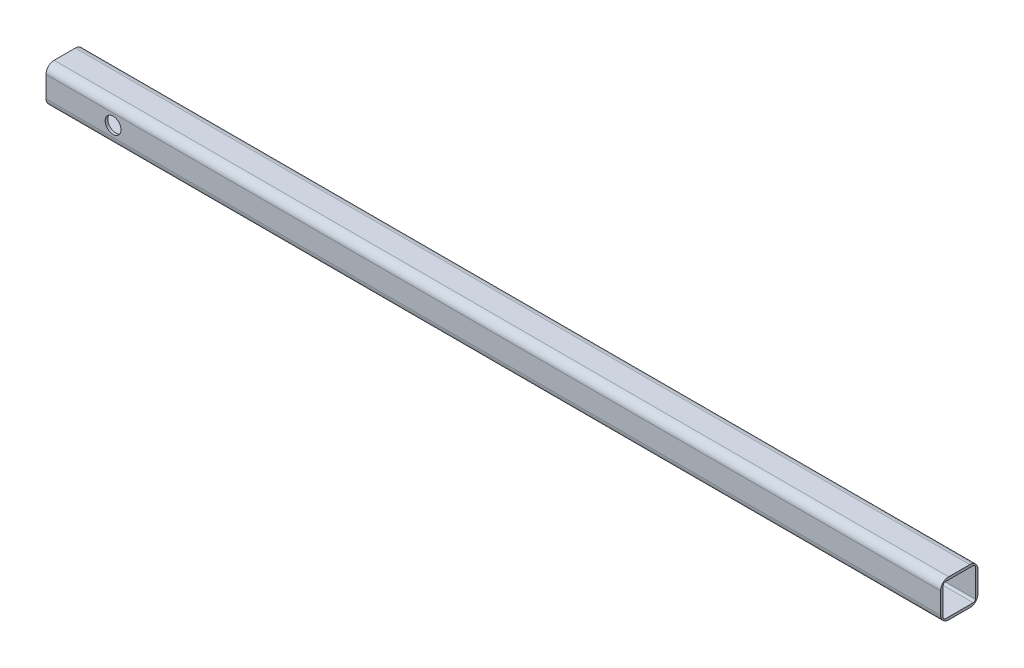
ISO-10303-21;
HEADER;
FILE_DESCRIPTION(('STEP AP214'),'2;1');
FILE_NAME('part.step','',(''),(''),'','','');
FILE_SCHEMA(('AUTOMOTIVE_DESIGN { 1 0 10303 214 1 1 1 1 }'));
ENDSEC;
DATA;
#1=APPLICATION_CONTEXT('core data for automotive mechanical design processes');
#2=APPLICATION_PROTOCOL_DEFINITION('international standard','automotive_design',2000,#1);
#3=PRODUCT_CONTEXT('',#1,'mechanical');
#4=PRODUCT('Part','Part','',(#3));
#5=PRODUCT_RELATED_PRODUCT_CATEGORY('part','',(#4));
#6=PRODUCT_DEFINITION_FORMATION('','',#4);
#7=PRODUCT_DEFINITION_CONTEXT('part definition',#1,'design');
#8=PRODUCT_DEFINITION('design','',#6,#7);
#9=PRODUCT_DEFINITION_SHAPE('','',#8);
#10=(LENGTH_UNIT() NAMED_UNIT(*) SI_UNIT(.MILLI.,.METRE.));
#11=(NAMED_UNIT(*) PLANE_ANGLE_UNIT() SI_UNIT($,.RADIAN.));
#12=(NAMED_UNIT(*) SI_UNIT($,.STERADIAN.) SOLID_ANGLE_UNIT());
#13=UNCERTAINTY_MEASURE_WITH_UNIT(LENGTH_MEASURE(1.E-05),#10,'distance_accuracy_value','');
#14=(GEOMETRIC_REPRESENTATION_CONTEXT(3) GLOBAL_UNCERTAINTY_ASSIGNED_CONTEXT((#13)) GLOBAL_UNIT_ASSIGNED_CONTEXT((#10,
#11,#12)) REPRESENTATION_CONTEXT('',''));
#15=CARTESIAN_POINT('',(0.,0.,0.));
#16=DIRECTION('',(0.,0.,1.));
#17=DIRECTION('',(1.,0.,0.));
#18=AXIS2_PLACEMENT_3D('',#15,#16,#17);
#19=CARTESIAN_POINT('',(558.8,18.288,-5.08));
#20=DIRECTION('',(1.,0.,0.));
#21=DIRECTION('',(0.,0.,-1.));
#22=AXIS2_PLACEMENT_3D('',#19,#20,#21);
#23=PLANE('',#22);
#24=CARTESIAN_POINT('',(558.8,18.288,-5.08));
#25=DIRECTION('',(1.,0.,0.));
#26=DIRECTION('',(0.,0.,-1.));
#27=AXIS2_PLACEMENT_3D('',#24,#25,#26);
#28=CIRCLE('',#27,5.08);
#29=CARTESIAN_POINT('',(558.8,23.368,-5.08));
#30=VERTEX_POINT('',#29);
#31=CARTESIAN_POINT('',(558.8,18.288,0.));
#32=VERTEX_POINT('',#31);
#33=EDGE_CURVE('E218',#30,#32,#28,.T.);
#34=ORIENTED_EDGE('',*,*,#33,.T.);
#35=DIRECTION('',(0.,-1.,0.));
#36=VECTOR('',#35,1.);
#37=CARTESIAN_POINT('',(558.8,5.08,0.));
#38=LINE('',#37,#36);
#39=CARTESIAN_POINT('',(558.8,5.08,0.));
#40=VERTEX_POINT('',#39);
#41=EDGE_CURVE('E221',#32,#40,#38,.T.);
#42=ORIENTED_EDGE('',*,*,#41,.T.);
#43=CARTESIAN_POINT('',(558.8,5.08,-5.08));
#44=DIRECTION('',(1.,0.,0.));
#45=DIRECTION('',(0.,0.,-1.));
#46=AXIS2_PLACEMENT_3D('',#43,#44,#45);
#47=CIRCLE('',#46,5.08);
#48=CARTESIAN_POINT('',(558.8,0.,-5.08));
#49=VERTEX_POINT('',#48);
#50=EDGE_CURVE('E224',#40,#49,#47,.T.);
#51=ORIENTED_EDGE('',*,*,#50,.T.);
#52=DIRECTION('',(0.,0.,-1.));
#53=VECTOR('',#52,1.);
#54=CARTESIAN_POINT('',(558.8,0.,-5.08));
#55=LINE('',#54,#53);
#56=CARTESIAN_POINT('',(558.8,0.,-18.288));
#57=VERTEX_POINT('',#56);
#58=EDGE_CURVE('E226',#49,#57,#55,.T.);
#59=ORIENTED_EDGE('',*,*,#58,.T.);
#60=CARTESIAN_POINT('',(558.8,5.08,-18.288));
#61=DIRECTION('',(1.,0.,0.));
#62=DIRECTION('',(0.,0.,-1.));
#63=AXIS2_PLACEMENT_3D('',#60,#61,#62);
#64=CIRCLE('',#63,5.08);
#65=CARTESIAN_POINT('',(558.8,5.08,-23.368));
#66=VERTEX_POINT('',#65);
#67=EDGE_CURVE('E228',#57,#66,#64,.T.);
#68=ORIENTED_EDGE('',*,*,#67,.T.);
#69=DIRECTION('',(0.,1.,0.));
#70=VECTOR('',#69,1.);
#71=CARTESIAN_POINT('',(558.8,5.08,-23.368));
#72=LINE('',#71,#70);
#73=CARTESIAN_POINT('',(558.8,18.288,-23.368));
#74=VERTEX_POINT('',#73);
#75=EDGE_CURVE('E230',#66,#74,#72,.T.);
#76=ORIENTED_EDGE('',*,*,#75,.T.);
#77=CARTESIAN_POINT('',(558.8,18.288,-18.288));
#78=DIRECTION('',(1.,0.,0.));
#79=DIRECTION('',(0.,0.,1.));
#80=AXIS2_PLACEMENT_3D('',#77,#78,#79);
#81=CIRCLE('',#80,5.08);
#82=CARTESIAN_POINT('',(558.8,23.368,-18.288));
#83=VERTEX_POINT('',#82);
#84=EDGE_CURVE('E232',#74,#83,#81,.T.);
#85=ORIENTED_EDGE('',*,*,#84,.T.);
#86=DIRECTION('',(0.,0.,1.));
#87=VECTOR('',#86,1.);
#88=CARTESIAN_POINT('',(558.8,23.368,-5.08));
#89=LINE('',#88,#87);
#90=EDGE_CURVE('E234',#83,#30,#89,.T.);
#91=ORIENTED_EDGE('',*,*,#90,.T.);
#92=EDGE_LOOP('',(#34,#42,#51,#59,#68,#76,#85,#91));
#93=FACE_BOUND('',#92,.T.);
#94=DIRECTION('',(0.,0.,-1.));
#95=VECTOR('',#94,1.);
#96=CARTESIAN_POINT('',(558.8,1.651,-2.92100000000001));
#97=LINE('',#96,#95);
#98=CARTESIAN_POINT('',(558.8,1.651,-2.92100000000001));
#99=VERTEX_POINT('',#98);
#100=CARTESIAN_POINT('',(558.8,1.651,-20.447));
#101=VERTEX_POINT('',#100);
#102=EDGE_CURVE('E159',#99,#101,#97,.T.);
#103=ORIENTED_EDGE('',*,*,#102,.F.);
#104=CARTESIAN_POINT('',(558.8,2.921,-2.921));
#105=DIRECTION('',(1.,0.,0.));
#106=DIRECTION('',(0.,0.,1.));
#107=AXIS2_PLACEMENT_3D('',#104,#105,#106);
#108=CIRCLE('',#107,1.27);
#109=CARTESIAN_POINT('',(558.8,2.92100000000001,-1.651));
#110=VERTEX_POINT('',#109);
#111=EDGE_CURVE('E151',#110,#99,#108,.T.);
#112=ORIENTED_EDGE('',*,*,#111,.F.);
#113=DIRECTION('',(0.,-1.,0.));
#114=VECTOR('',#113,1.);
#115=CARTESIAN_POINT('',(558.8,2.92100000000001,-1.651));
#116=LINE('',#115,#114);
#117=CARTESIAN_POINT('',(558.8,20.447,-1.651));
#118=VERTEX_POINT('',#117);
#119=EDGE_CURVE('E185',#118,#110,#116,.T.);
#120=ORIENTED_EDGE('',*,*,#119,.F.);
#121=CARTESIAN_POINT('',(558.8,20.447,-2.921));
#122=DIRECTION('',(1.,0.,0.));
#123=DIRECTION('',(0.,0.,-1.));
#124=AXIS2_PLACEMENT_3D('',#121,#122,#123);
#125=CIRCLE('',#124,1.27);
#126=CARTESIAN_POINT('',(558.8,21.717,-2.92100000000001));
#127=VERTEX_POINT('',#126);
#128=EDGE_CURVE('E183',#127,#118,#125,.T.);
#129=ORIENTED_EDGE('',*,*,#128,.F.);
#130=DIRECTION('',(0.,0.,1.));
#131=VECTOR('',#130,1.);
#132=CARTESIAN_POINT('',(558.8,21.717,-2.92100000000001));
#133=LINE('',#132,#131);
#134=CARTESIAN_POINT('',(558.8,21.717,-20.447));
#135=VERTEX_POINT('',#134);
#136=EDGE_CURVE('E181',#135,#127,#133,.T.);
#137=ORIENTED_EDGE('',*,*,#136,.F.);
#138=CARTESIAN_POINT('',(558.8,20.447,-20.447));
#139=DIRECTION('',(1.,0.,0.));
#140=DIRECTION('',(0.,0.,1.));
#141=AXIS2_PLACEMENT_3D('',#138,#139,#140);
#142=CIRCLE('',#141,1.27);
#143=CARTESIAN_POINT('',(558.8,20.447,-21.717));
#144=VERTEX_POINT('',#143);
#145=EDGE_CURVE('E179',#144,#135,#142,.T.);
#146=ORIENTED_EDGE('',*,*,#145,.F.);
#147=DIRECTION('',(0.,1.,0.));
#148=VECTOR('',#147,1.);
#149=CARTESIAN_POINT('',(558.8,2.92100000000001,-21.717));
#150=LINE('',#149,#148);
#151=CARTESIAN_POINT('',(558.8,2.921,-21.717));
#152=VERTEX_POINT('',#151);
#153=EDGE_CURVE('E174',#152,#144,#150,.T.);
#154=ORIENTED_EDGE('',*,*,#153,.F.);
#155=CARTESIAN_POINT('',(558.8,2.921,-20.447));
#156=DIRECTION('',(1.,0.,0.));
#157=DIRECTION('',(0.,0.,-1.));
#158=AXIS2_PLACEMENT_3D('',#155,#156,#157);
#159=CIRCLE('',#158,1.27);
#160=EDGE_CURVE('E172',#101,#152,#159,.T.);
#161=ORIENTED_EDGE('',*,*,#160,.F.);
#162=EDGE_LOOP('',(#103,#112,#120,#129,#137,#146,#154,#161));
#163=FACE_BOUND('',#162,.T.);
#164=ADVANCED_FACE('F37',(#93,#163),#23,.T.);
#165=CARTESIAN_POINT('',(0.,18.288,-5.08));
#166=DIRECTION('',(1.,0.,0.));
#167=DIRECTION('',(0.,0.,-1.));
#168=AXIS2_PLACEMENT_3D('',#165,#166,#167);
#169=PLANE('',#168);
#170=CARTESIAN_POINT('',(0.,18.288,-5.08));
#171=DIRECTION('',(1.,0.,0.));
#172=DIRECTION('',(0.,0.,-1.));
#173=AXIS2_PLACEMENT_3D('',#170,#171,#172);
#174=CIRCLE('',#173,5.08);
#175=CARTESIAN_POINT('',(0.,23.368,-5.08));
#176=VERTEX_POINT('',#175);
#177=CARTESIAN_POINT('',(0.,18.288,0.));
#178=VERTEX_POINT('',#177);
#179=EDGE_CURVE('E167',#176,#178,#174,.T.);
#180=ORIENTED_EDGE('',*,*,#179,.F.);
#181=DIRECTION('',(0.,0.,1.));
#182=VECTOR('',#181,1.);
#183=CARTESIAN_POINT('',(0.,23.368,-5.08));
#184=LINE('',#183,#182);
#185=CARTESIAN_POINT('',(0.,23.368,-18.288));
#186=VERTEX_POINT('',#185);
#187=EDGE_CURVE('E222',#186,#176,#184,.T.);
#188=ORIENTED_EDGE('',*,*,#187,.F.);
#189=CARTESIAN_POINT('',(0.,18.288,-18.288));
#190=DIRECTION('',(1.,0.,0.));
#191=DIRECTION('',(0.,0.,1.));
#192=AXIS2_PLACEMENT_3D('',#189,#190,#191);
#193=CIRCLE('',#192,5.08);
#194=CARTESIAN_POINT('',(0.,18.288,-23.368));
#195=VERTEX_POINT('',#194);
#196=EDGE_CURVE('E249',#195,#186,#193,.T.);
#197=ORIENTED_EDGE('',*,*,#196,.F.);
#198=DIRECTION('',(0.,1.,0.));
#199=VECTOR('',#198,1.);
#200=CARTESIAN_POINT('',(0.,5.08,-23.368));
#201=LINE('',#200,#199);
#202=CARTESIAN_POINT('',(0.,5.08,-23.368));
#203=VERTEX_POINT('',#202);
#204=EDGE_CURVE('E247',#203,#195,#201,.T.);
#205=ORIENTED_EDGE('',*,*,#204,.F.);
#206=CARTESIAN_POINT('',(0.,5.08,-18.288));
#207=DIRECTION('',(1.,0.,0.));
#208=DIRECTION('',(0.,0.,-1.));
#209=AXIS2_PLACEMENT_3D('',#206,#207,#208);
#210=CIRCLE('',#209,5.08);
#211=CARTESIAN_POINT('',(0.,0.,-18.288));
#212=VERTEX_POINT('',#211);
#213=EDGE_CURVE('E245',#212,#203,#210,.T.);
#214=ORIENTED_EDGE('',*,*,#213,.F.);
#215=DIRECTION('',(0.,0.,-1.));
#216=VECTOR('',#215,1.);
#217=CARTESIAN_POINT('',(0.,0.,-5.08));
#218=LINE('',#217,#216);
#219=CARTESIAN_POINT('',(0.,0.,-5.08));
#220=VERTEX_POINT('',#219);
#221=EDGE_CURVE('E243',#220,#212,#218,.T.);
#222=ORIENTED_EDGE('',*,*,#221,.F.);
#223=CARTESIAN_POINT('',(0.,5.08,-5.08));
#224=DIRECTION('',(1.,0.,0.));
#225=DIRECTION('',(0.,0.,-1.));
#226=AXIS2_PLACEMENT_3D('',#223,#224,#225);
#227=CIRCLE('',#226,5.08);
#228=CARTESIAN_POINT('',(0.,5.08,0.));
#229=VERTEX_POINT('',#228);
#230=EDGE_CURVE('E241',#229,#220,#227,.T.);
#231=ORIENTED_EDGE('',*,*,#230,.F.);
#232=DIRECTION('',(0.,-1.,0.));
#233=VECTOR('',#232,1.);
#234=CARTESIAN_POINT('',(0.,5.08,0.));
#235=LINE('',#234,#233);
#236=EDGE_CURVE('E239',#178,#229,#235,.T.);
#237=ORIENTED_EDGE('',*,*,#236,.F.);
#238=EDGE_LOOP('',(#180,#188,#197,#205,#214,#222,#231,#237));
#239=FACE_BOUND('',#238,.T.);
#240=CARTESIAN_POINT('',(0.,2.921,-2.921));
#241=DIRECTION('',(1.,0.,0.));
#242=DIRECTION('',(0.,0.,1.));
#243=AXIS2_PLACEMENT_3D('',#240,#241,#242);
#244=CIRCLE('',#243,1.27);
#245=CARTESIAN_POINT('',(0.,2.92100000000001,-1.651));
#246=VERTEX_POINT('',#245);
#247=CARTESIAN_POINT('',(0.,1.651,-2.92100000000001));
#248=VERTEX_POINT('',#247);
#249=EDGE_CURVE('E61',#246,#248,#244,.T.);
#250=ORIENTED_EDGE('',*,*,#249,.T.);
#251=DIRECTION('',(0.,0.,-1.));
#252=VECTOR('',#251,1.);
#253=CARTESIAN_POINT('',(0.,1.651,-2.92100000000001));
#254=LINE('',#253,#252);
#255=CARTESIAN_POINT('',(0.,1.651,-20.447));
#256=VERTEX_POINT('',#255);
#257=EDGE_CURVE('E166',#248,#256,#254,.T.);
#258=ORIENTED_EDGE('',*,*,#257,.T.);
#259=CARTESIAN_POINT('',(0.,2.921,-20.447));
#260=DIRECTION('',(1.,0.,0.));
#261=DIRECTION('',(0.,0.,-1.));
#262=AXIS2_PLACEMENT_3D('',#259,#260,#261);
#263=CIRCLE('',#262,1.27);
#264=CARTESIAN_POINT('',(0.,2.921,-21.717));
#265=VERTEX_POINT('',#264);
#266=EDGE_CURVE('E190',#256,#265,#263,.T.);
#267=ORIENTED_EDGE('',*,*,#266,.T.);
#268=DIRECTION('',(0.,1.,0.));
#269=VECTOR('',#268,1.);
#270=CARTESIAN_POINT('',(0.,2.92100000000001,-21.717));
#271=LINE('',#270,#269);
#272=CARTESIAN_POINT('',(0.,20.447,-21.717));
#273=VERTEX_POINT('',#272);
#274=EDGE_CURVE('E193',#265,#273,#271,.T.);
#275=ORIENTED_EDGE('',*,*,#274,.T.);
#276=CARTESIAN_POINT('',(0.,20.447,-20.447));
#277=DIRECTION('',(1.,0.,0.));
#278=DIRECTION('',(0.,0.,1.));
#279=AXIS2_PLACEMENT_3D('',#276,#277,#278);
#280=CIRCLE('',#279,1.27);
#281=CARTESIAN_POINT('',(0.,21.717,-20.447));
#282=VERTEX_POINT('',#281);
#283=EDGE_CURVE('E196',#273,#282,#280,.T.);
#284=ORIENTED_EDGE('',*,*,#283,.T.);
#285=DIRECTION('',(0.,0.,1.));
#286=VECTOR('',#285,1.);
#287=CARTESIAN_POINT('',(0.,21.717,-2.92100000000001));
#288=LINE('',#287,#286);
#289=CARTESIAN_POINT('',(0.,21.717,-2.92100000000001));
#290=VERTEX_POINT('',#289);
#291=EDGE_CURVE('E199',#282,#290,#288,.T.);
#292=ORIENTED_EDGE('',*,*,#291,.T.);
#293=CARTESIAN_POINT('',(0.,20.447,-2.921));
#294=DIRECTION('',(1.,0.,0.));
#295=DIRECTION('',(0.,0.,-1.));
#296=AXIS2_PLACEMENT_3D('',#293,#294,#295);
#297=CIRCLE('',#296,1.27);
#298=CARTESIAN_POINT('',(0.,20.447,-1.651));
#299=VERTEX_POINT('',#298);
#300=EDGE_CURVE('E202',#290,#299,#297,.T.);
#301=ORIENTED_EDGE('',*,*,#300,.T.);
#302=DIRECTION('',(0.,-1.,0.));
#303=VECTOR('',#302,1.);
#304=CARTESIAN_POINT('',(0.,2.92100000000001,-1.651));
#305=LINE('',#304,#303);
#306=EDGE_CURVE('E160',#299,#246,#305,.T.);
#307=ORIENTED_EDGE('',*,*,#306,.T.);
#308=EDGE_LOOP('',(#250,#258,#267,#275,#284,#292,#301,#307));
#309=FACE_BOUND('',#308,.T.);
#310=ADVANCED_FACE('F280',(#239,#309),#169,.F.);
#311=CARTESIAN_POINT('',(558.8,18.288,-5.08));
#312=DIRECTION('',(-1.,0.,0.));
#313=DIRECTION('',(0.,0.,1.));
#314=AXIS2_PLACEMENT_3D('',#311,#312,#313);
#315=CYLINDRICAL_SURFACE('',#314,5.08);
#316=ORIENTED_EDGE('',*,*,#179,.T.);
#317=DIRECTION('',(-1.,0.,0.));
#318=VECTOR('',#317,1.);
#319=CARTESIAN_POINT('',(558.8,18.288,0.));
#320=LINE('',#319,#318);
#321=EDGE_CURVE('E11',#32,#178,#320,.T.);
#322=ORIENTED_EDGE('',*,*,#321,.F.);
#323=ORIENTED_EDGE('',*,*,#33,.F.);
#324=DIRECTION('',(-1.,0.,0.));
#325=VECTOR('',#324,1.);
#326=CARTESIAN_POINT('',(558.8,23.368,-5.08));
#327=LINE('',#326,#325);
#328=EDGE_CURVE('E236',#30,#176,#327,.T.);
#329=ORIENTED_EDGE('',*,*,#328,.T.);
#330=EDGE_LOOP('',(#316,#322,#323,#329));
#331=FACE_BOUND('',#330,.T.);
#332=ADVANCED_FACE('F39',(#331),#315,.T.);
#333=CARTESIAN_POINT('',(558.8,5.08,0.));
#334=DIRECTION('',(0.,0.,-1.));
#335=DIRECTION('',(-1.,0.,0.));
#336=AXIS2_PLACEMENT_3D('',#333,#334,#335);
#337=PLANE('',#336);
#338=CARTESIAN_POINT('',(41.91,11.684,0.));
#339=DIRECTION('',(0.,0.,1.));
#340=DIRECTION('',(1.,0.,0.));
#341=AXIS2_PLACEMENT_3D('',#338,#339,#340);
#342=CIRCLE('',#341,4.953);
#343=CARTESIAN_POINT('',(46.863,11.684,0.));
#344=VERTEX_POINT('',#343);
#345=EDGE_CURVE('E377',#344,#344,#342,.T.);
#346=ORIENTED_EDGE('',*,*,#345,.F.);
#347=EDGE_LOOP('',(#346));
#348=FACE_BOUND('',#347,.T.);
#349=ORIENTED_EDGE('',*,*,#236,.T.);
#350=DIRECTION('',(-1.,0.,0.));
#351=VECTOR('',#350,1.);
#352=CARTESIAN_POINT('',(558.8,5.08,0.));
#353=LINE('',#352,#351);
#354=EDGE_CURVE('E46',#40,#229,#353,.T.);
#355=ORIENTED_EDGE('',*,*,#354,.F.);
#356=ORIENTED_EDGE('',*,*,#41,.F.);
#357=ORIENTED_EDGE('',*,*,#321,.T.);
#358=EDGE_LOOP('',(#349,#355,#356,#357));
#359=FACE_BOUND('',#358,.T.);
#360=ADVANCED_FACE('F297',(#348,#359),#337,.F.);
#361=CARTESIAN_POINT('',(558.8,5.08,-5.08));
#362=DIRECTION('',(-1.,0.,0.));
#363=DIRECTION('',(0.,0.,1.));
#364=AXIS2_PLACEMENT_3D('',#361,#362,#363);
#365=CYLINDRICAL_SURFACE('',#364,5.08);
#366=ORIENTED_EDGE('',*,*,#230,.T.);
#367=DIRECTION('',(-1.,0.,0.));
#368=VECTOR('',#367,1.);
#369=CARTESIAN_POINT('',(558.8,0.,-5.08));
#370=LINE('',#369,#368);
#371=EDGE_CURVE('E266',#49,#220,#370,.T.);
#372=ORIENTED_EDGE('',*,*,#371,.F.);
#373=ORIENTED_EDGE('',*,*,#50,.F.);
#374=ORIENTED_EDGE('',*,*,#354,.T.);
#375=EDGE_LOOP('',(#366,#372,#373,#374));
#376=FACE_BOUND('',#375,.T.);
#377=ADVANCED_FACE('F274',(#376),#365,.T.);
#378=CARTESIAN_POINT('',(558.8,0.,-5.08));
#379=DIRECTION('',(0.,1.,0.));
#380=DIRECTION('',(0.,0.,1.));
#381=AXIS2_PLACEMENT_3D('',#378,#379,#380);
#382=PLANE('',#381);
#383=ORIENTED_EDGE('',*,*,#221,.T.);
#384=DIRECTION('',(-1.,0.,0.));
#385=VECTOR('',#384,1.);
#386=CARTESIAN_POINT('',(558.8,0.,-18.288));
#387=LINE('',#386,#385);
#388=EDGE_CURVE('E263',#57,#212,#387,.T.);
#389=ORIENTED_EDGE('',*,*,#388,.F.);
#390=ORIENTED_EDGE('',*,*,#58,.F.);
#391=ORIENTED_EDGE('',*,*,#371,.T.);
#392=EDGE_LOOP('',(#383,#389,#390,#391));
#393=FACE_BOUND('',#392,.T.);
#394=ADVANCED_FACE('F286',(#393),#382,.F.);
#395=CARTESIAN_POINT('',(558.8,5.08,-18.288));
#396=DIRECTION('',(-1.,0.,0.));
#397=DIRECTION('',(0.,0.,1.));
#398=AXIS2_PLACEMENT_3D('',#395,#396,#397);
#399=CYLINDRICAL_SURFACE('',#398,5.08);
#400=ORIENTED_EDGE('',*,*,#213,.T.);
#401=DIRECTION('',(-1.,0.,0.));
#402=VECTOR('',#401,1.);
#403=CARTESIAN_POINT('',(558.8,5.08,-23.368));
#404=LINE('',#403,#402);
#405=EDGE_CURVE('E260',#66,#203,#404,.T.);
#406=ORIENTED_EDGE('',*,*,#405,.F.);
#407=ORIENTED_EDGE('',*,*,#67,.F.);
#408=ORIENTED_EDGE('',*,*,#388,.T.);
#409=EDGE_LOOP('',(#400,#406,#407,#408));
#410=FACE_BOUND('',#409,.T.);
#411=ADVANCED_FACE('F290',(#410),#399,.T.);
#412=CARTESIAN_POINT('',(558.8,5.08,-23.368));
#413=DIRECTION('',(0.,0.,1.));
#414=DIRECTION('',(1.,0.,0.));
#415=AXIS2_PLACEMENT_3D('',#412,#413,#414);
#416=PLANE('',#415);
#417=CARTESIAN_POINT('',(41.91,11.684,-23.368));
#418=DIRECTION('',(0.,0.,1.));
#419=DIRECTION('',(1.,0.,0.));
#420=AXIS2_PLACEMENT_3D('',#417,#418,#419);
#421=CIRCLE('',#420,4.953);
#422=CARTESIAN_POINT('',(46.863,11.684,-23.368));
#423=VERTEX_POINT('',#422);
#424=EDGE_CURVE('E379',#423,#423,#421,.F.);
#425=ORIENTED_EDGE('',*,*,#424,.F.);
#426=EDGE_LOOP('',(#425));
#427=FACE_BOUND('',#426,.T.);
#428=ORIENTED_EDGE('',*,*,#204,.T.);
#429=DIRECTION('',(-1.,0.,0.));
#430=VECTOR('',#429,1.);
#431=CARTESIAN_POINT('',(558.8,18.288,-23.368));
#432=LINE('',#431,#430);
#433=EDGE_CURVE('E257',#74,#195,#432,.T.);
#434=ORIENTED_EDGE('',*,*,#433,.F.);
#435=ORIENTED_EDGE('',*,*,#75,.F.);
#436=ORIENTED_EDGE('',*,*,#405,.T.);
#437=EDGE_LOOP('',(#428,#434,#435,#436));
#438=FACE_BOUND('',#437,.T.);
#439=ADVANCED_FACE('F310',(#427,#438),#416,.F.);
#440=CARTESIAN_POINT('',(558.8,18.288,-18.288));
#441=DIRECTION('',(-1.,0.,0.));
#442=DIRECTION('',(0.,0.,1.));
#443=AXIS2_PLACEMENT_3D('',#440,#441,#442);
#444=CYLINDRICAL_SURFACE('',#443,5.08);
#445=ORIENTED_EDGE('',*,*,#196,.T.);
#446=DIRECTION('',(-1.,0.,0.));
#447=VECTOR('',#446,1.);
#448=CARTESIAN_POINT('',(558.8,23.368,-18.288));
#449=LINE('',#448,#447);
#450=EDGE_CURVE('E254',#83,#186,#449,.T.);
#451=ORIENTED_EDGE('',*,*,#450,.F.);
#452=ORIENTED_EDGE('',*,*,#84,.F.);
#453=ORIENTED_EDGE('',*,*,#433,.T.);
#454=EDGE_LOOP('',(#445,#451,#452,#453));
#455=FACE_BOUND('',#454,.T.);
#456=ADVANCED_FACE('F308',(#455),#444,.T.);
#457=CARTESIAN_POINT('',(558.8,23.368,-5.08));
#458=DIRECTION('',(0.,-1.,0.));
#459=DIRECTION('',(0.,0.,-1.));
#460=AXIS2_PLACEMENT_3D('',#457,#458,#459);
#461=PLANE('',#460);
#462=ORIENTED_EDGE('',*,*,#187,.T.);
#463=ORIENTED_EDGE('',*,*,#328,.F.);
#464=ORIENTED_EDGE('',*,*,#90,.F.);
#465=ORIENTED_EDGE('',*,*,#450,.T.);
#466=EDGE_LOOP('',(#462,#463,#464,#465));
#467=FACE_BOUND('',#466,.T.);
#468=ADVANCED_FACE('F303',(#467),#461,.F.);
#469=CARTESIAN_POINT('',(558.8,2.921,-2.921));
#470=DIRECTION('',(-1.,0.,0.));
#471=DIRECTION('',(0.,0.,1.));
#472=AXIS2_PLACEMENT_3D('',#469,#470,#471);
#473=CYLINDRICAL_SURFACE('',#472,1.27);
#474=ORIENTED_EDGE('',*,*,#249,.F.);
#475=DIRECTION('',(-1.,0.,0.));
#476=VECTOR('',#475,1.);
#477=CARTESIAN_POINT('',(558.8,2.92100000000001,-1.651));
#478=LINE('',#477,#476);
#479=EDGE_CURVE('E155',#110,#246,#478,.T.);
#480=ORIENTED_EDGE('',*,*,#479,.F.);
#481=ORIENTED_EDGE('',*,*,#111,.T.);
#482=DIRECTION('',(-1.,0.,0.));
#483=VECTOR('',#482,1.);
#484=CARTESIAN_POINT('',(558.8,1.651,-2.92100000000001));
#485=LINE('',#484,#483);
#486=EDGE_CURVE('E154',#99,#248,#485,.T.);
#487=ORIENTED_EDGE('',*,*,#486,.T.);
#488=EDGE_LOOP('',(#474,#480,#481,#487));
#489=FACE_BOUND('',#488,.T.);
#490=ADVANCED_FACE('F153',(#489),#473,.F.);
#491=CARTESIAN_POINT('',(558.8,1.651,-2.92100000000001));
#492=DIRECTION('',(0.,1.,0.));
#493=DIRECTION('',(0.,0.,1.));
#494=AXIS2_PLACEMENT_3D('',#491,#492,#493);
#495=PLANE('',#494);
#496=ORIENTED_EDGE('',*,*,#257,.F.);
#497=ORIENTED_EDGE('',*,*,#486,.F.);
#498=ORIENTED_EDGE('',*,*,#102,.T.);
#499=DIRECTION('',(-1.,0.,0.));
#500=VECTOR('',#499,1.);
#501=CARTESIAN_POINT('',(558.8,1.651,-20.447));
#502=LINE('',#501,#500);
#503=EDGE_CURVE('E168',#101,#256,#502,.T.);
#504=ORIENTED_EDGE('',*,*,#503,.T.);
#505=EDGE_LOOP('',(#496,#497,#498,#504));
#506=FACE_BOUND('',#505,.T.);
#507=ADVANCED_FACE('F163',(#506),#495,.T.);
#508=CARTESIAN_POINT('',(558.8,2.921,-20.447));
#509=DIRECTION('',(-1.,0.,0.));
#510=DIRECTION('',(0.,0.,1.));
#511=AXIS2_PLACEMENT_3D('',#508,#509,#510);
#512=CYLINDRICAL_SURFACE('',#511,1.27);
#513=ORIENTED_EDGE('',*,*,#266,.F.);
#514=ORIENTED_EDGE('',*,*,#503,.F.);
#515=ORIENTED_EDGE('',*,*,#160,.T.);
#516=DIRECTION('',(-1.,0.,0.));
#517=VECTOR('',#516,1.);
#518=CARTESIAN_POINT('',(558.8,2.921,-21.717));
#519=LINE('',#518,#517);
#520=EDGE_CURVE('E215',#152,#265,#519,.T.);
#521=ORIENTED_EDGE('',*,*,#520,.T.);
#522=EDGE_LOOP('',(#513,#514,#515,#521));
#523=FACE_BOUND('',#522,.T.);
#524=ADVANCED_FACE('F337',(#523),#512,.F.);
#525=CARTESIAN_POINT('',(558.8,2.92100000000001,-21.717));
#526=DIRECTION('',(0.,0.,1.));
#527=DIRECTION('',(0.,-1.,0.));
#528=AXIS2_PLACEMENT_3D('',#525,#526,#527);
#529=PLANE('',#528);
#530=CARTESIAN_POINT('',(41.91,11.684,-21.717));
#531=DIRECTION('',(0.,0.,1.));
#532=DIRECTION('',(0.,-1.,0.));
#533=AXIS2_PLACEMENT_3D('',#530,#531,#532);
#534=CIRCLE('',#533,4.953);
#535=CARTESIAN_POINT('',(41.91,6.73100000000001,-21.717));
#536=VERTEX_POINT('',#535);
#537=EDGE_CURVE('E188',#536,#536,#534,.T.);
#538=ORIENTED_EDGE('',*,*,#537,.F.);
#539=EDGE_LOOP('',(#538));
#540=FACE_BOUND('',#539,.T.);
#541=ORIENTED_EDGE('',*,*,#274,.F.);
#542=ORIENTED_EDGE('',*,*,#520,.F.);
#543=ORIENTED_EDGE('',*,*,#153,.T.);
#544=DIRECTION('',(-1.,0.,0.));
#545=VECTOR('',#544,1.);
#546=CARTESIAN_POINT('',(558.8,20.447,-21.717));
#547=LINE('',#546,#545);
#548=EDGE_CURVE('E213',#144,#273,#547,.T.);
#549=ORIENTED_EDGE('',*,*,#548,.T.);
#550=EDGE_LOOP('',(#541,#542,#543,#549));
#551=FACE_BOUND('',#550,.T.);
#552=ADVANCED_FACE('F341',(#540,#551),#529,.T.);
#553=CARTESIAN_POINT('',(558.8,20.447,-20.447));
#554=DIRECTION('',(-1.,0.,0.));
#555=DIRECTION('',(0.,0.,1.));
#556=AXIS2_PLACEMENT_3D('',#553,#554,#555);
#557=CYLINDRICAL_SURFACE('',#556,1.27);
#558=ORIENTED_EDGE('',*,*,#283,.F.);
#559=ORIENTED_EDGE('',*,*,#548,.F.);
#560=ORIENTED_EDGE('',*,*,#145,.T.);
#561=DIRECTION('',(-1.,0.,0.));
#562=VECTOR('',#561,1.);
#563=CARTESIAN_POINT('',(558.8,21.717,-20.447));
#564=LINE('',#563,#562);
#565=EDGE_CURVE('E211',#135,#282,#564,.T.);
#566=ORIENTED_EDGE('',*,*,#565,.T.);
#567=EDGE_LOOP('',(#558,#559,#560,#566));
#568=FACE_BOUND('',#567,.T.);
#569=ADVANCED_FACE('F347',(#568),#557,.F.);
#570=CARTESIAN_POINT('',(558.8,21.717,-2.92100000000001));
#571=DIRECTION('',(0.,-1.,0.));
#572=DIRECTION('',(0.,0.,-1.));
#573=AXIS2_PLACEMENT_3D('',#570,#571,#572);
#574=PLANE('',#573);
#575=ORIENTED_EDGE('',*,*,#291,.F.);
#576=ORIENTED_EDGE('',*,*,#565,.F.);
#577=ORIENTED_EDGE('',*,*,#136,.T.);
#578=DIRECTION('',(-1.,0.,0.));
#579=VECTOR('',#578,1.);
#580=CARTESIAN_POINT('',(558.8,21.717,-2.92100000000001));
#581=LINE('',#580,#579);
#582=EDGE_CURVE('E209',#127,#290,#581,.T.);
#583=ORIENTED_EDGE('',*,*,#582,.T.);
#584=EDGE_LOOP('',(#575,#576,#577,#583));
#585=FACE_BOUND('',#584,.T.);
#586=ADVANCED_FACE('F351',(#585),#574,.T.);
#587=CARTESIAN_POINT('',(558.8,20.447,-2.921));
#588=DIRECTION('',(-1.,0.,0.));
#589=DIRECTION('',(0.,0.,1.));
#590=AXIS2_PLACEMENT_3D('',#587,#588,#589);
#591=CYLINDRICAL_SURFACE('',#590,1.27);
#592=ORIENTED_EDGE('',*,*,#300,.F.);
#593=ORIENTED_EDGE('',*,*,#582,.F.);
#594=ORIENTED_EDGE('',*,*,#128,.T.);
#595=DIRECTION('',(-1.,0.,0.));
#596=VECTOR('',#595,1.);
#597=CARTESIAN_POINT('',(558.8,20.447,-1.651));
#598=LINE('',#597,#596);
#599=EDGE_CURVE('E53',#118,#299,#598,.T.);
#600=ORIENTED_EDGE('',*,*,#599,.T.);
#601=EDGE_LOOP('',(#592,#593,#594,#600));
#602=FACE_BOUND('',#601,.T.);
#603=ADVANCED_FACE('F355',(#602),#591,.F.);
#604=CARTESIAN_POINT('',(558.8,2.92100000000001,-1.651));
#605=DIRECTION('',(0.,0.,-1.));
#606=DIRECTION('',(0.,1.,0.));
#607=AXIS2_PLACEMENT_3D('',#604,#605,#606);
#608=PLANE('',#607);
#609=CARTESIAN_POINT('',(41.91,11.684,-1.651));
#610=DIRECTION('',(0.,0.,-1.));
#611=DIRECTION('',(0.,1.,0.));
#612=AXIS2_PLACEMENT_3D('',#609,#610,#611);
#613=CIRCLE('',#612,4.953);
#614=CARTESIAN_POINT('',(41.91,16.637,-1.651));
#615=VERTEX_POINT('',#614);
#616=EDGE_CURVE('E41',#615,#615,#613,.T.);
#617=ORIENTED_EDGE('',*,*,#616,.F.);
#618=EDGE_LOOP('',(#617));
#619=FACE_BOUND('',#618,.T.);
#620=ORIENTED_EDGE('',*,*,#306,.F.);
#621=ORIENTED_EDGE('',*,*,#599,.F.);
#622=ORIENTED_EDGE('',*,*,#119,.T.);
#623=ORIENTED_EDGE('',*,*,#479,.T.);
#624=EDGE_LOOP('',(#620,#621,#622,#623));
#625=FACE_BOUND('',#624,.T.);
#626=ADVANCED_FACE('F359',(#619,#625),#608,.T.);
#627=CARTESIAN_POINT('',(41.91,11.684,-37.3771995488679));
#628=DIRECTION('',(0.,0.,1.));
#629=DIRECTION('',(1.,0.,0.));
#630=AXIS2_PLACEMENT_3D('',#627,#628,#629);
#631=CYLINDRICAL_SURFACE('',#630,4.953);
#632=ORIENTED_EDGE('',*,*,#616,.T.);
#633=EDGE_LOOP('',(#632));
#634=FACE_BOUND('',#633,.T.);
#635=ORIENTED_EDGE('',*,*,#345,.T.);
#636=EDGE_LOOP('',(#635));
#637=FACE_BOUND('',#636,.T.);
#638=ADVANCED_FACE('F363',(#634,#637),#631,.F.);
#639=ORIENTED_EDGE('',*,*,#537,.T.);
#640=EDGE_LOOP('',(#639));
#641=FACE_BOUND('',#640,.T.);
#642=ORIENTED_EDGE('',*,*,#424,.T.);
#643=EDGE_LOOP('',(#642));
#644=FACE_BOUND('',#643,.T.);
#645=ADVANCED_FACE('F366',(#641,#644),#631,.F.);
#646=CLOSED_SHELL('',(#164,#310,#332,#360,#377,#394,#411,#439,#456,#468,#490,#507,#524,#552,
#569,#586,#603,#626,#638,#645));
#647=MANIFOLD_SOLID_BREP('B2',#646);
#648=ADVANCED_BREP_SHAPE_REPRESENTATION('',(#18,#647),#14);
#649=SHAPE_DEFINITION_REPRESENTATION(#9,#648);
ENDSEC;
END-ISO-10303-21;
